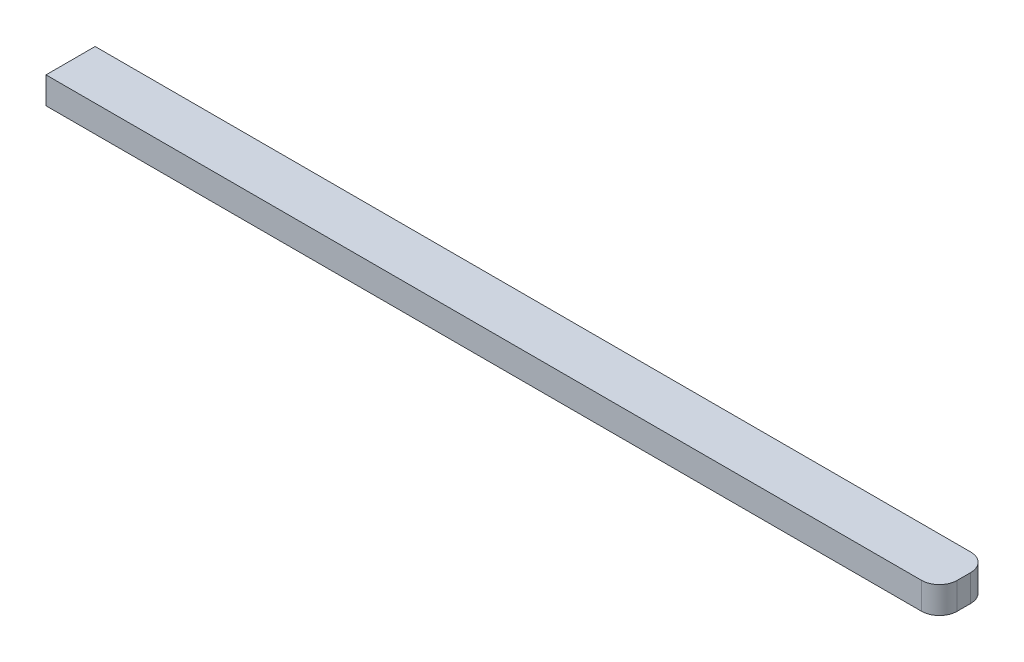
ISO-10303-21;
HEADER;
FILE_DESCRIPTION(('STEP AP214'),'2;1');
FILE_NAME('part.step','',(''),(''),'','','');
FILE_SCHEMA(('AUTOMOTIVE_DESIGN { 1 0 10303 214 1 1 1 1 }'));
ENDSEC;
DATA;
#1=APPLICATION_CONTEXT('core data for automotive mechanical design processes');
#2=APPLICATION_PROTOCOL_DEFINITION('international standard','automotive_design',2000,#1);
#3=PRODUCT_CONTEXT('',#1,'mechanical');
#4=PRODUCT('Part','Part','',(#3));
#5=PRODUCT_RELATED_PRODUCT_CATEGORY('part','',(#4));
#6=PRODUCT_DEFINITION_FORMATION('','',#4);
#7=PRODUCT_DEFINITION_CONTEXT('part definition',#1,'design');
#8=PRODUCT_DEFINITION('design','',#6,#7);
#9=PRODUCT_DEFINITION_SHAPE('','',#8);
#10=(LENGTH_UNIT() NAMED_UNIT(*) SI_UNIT(.MILLI.,.METRE.));
#11=(NAMED_UNIT(*) PLANE_ANGLE_UNIT() SI_UNIT($,.RADIAN.));
#12=(NAMED_UNIT(*) SI_UNIT($,.STERADIAN.) SOLID_ANGLE_UNIT());
#13=UNCERTAINTY_MEASURE_WITH_UNIT(LENGTH_MEASURE(1.E-05),#10,'distance_accuracy_value','');
#14=(GEOMETRIC_REPRESENTATION_CONTEXT(3) GLOBAL_UNCERTAINTY_ASSIGNED_CONTEXT((#13)) GLOBAL_UNIT_ASSIGNED_CONTEXT((#10,
#11,#12)) REPRESENTATION_CONTEXT('',''));
#15=CARTESIAN_POINT('',(0.,0.,0.));
#16=DIRECTION('',(0.,0.,1.));
#17=DIRECTION('',(1.,0.,0.));
#18=AXIS2_PLACEMENT_3D('',#15,#16,#17);
#19=CARTESIAN_POINT('',(-56.596735768236,3.,-1.88128287926879));
#20=DIRECTION('',(1.,0.,0.));
#21=DIRECTION('',(0.,0.,-1.));
#22=AXIS2_PLACEMENT_3D('',#19,#20,#21);
#23=PLANE('',#22);
#24=DIRECTION('',(0.,0.,1.));
#25=VECTOR('',#24,1.);
#26=CARTESIAN_POINT('',(-56.596735768236,0.,-1.88128287926879));
#27=LINE('',#26,#25);
#28=CARTESIAN_POINT('',(-56.596735768236,0.,-1.88128287926879));
#29=VERTEX_POINT('',#28);
#30=CARTESIAN_POINT('',(-56.596735768236,0.,3.61871712073121));
#31=VERTEX_POINT('',#30);
#32=EDGE_CURVE('E115',#29,#31,#27,.T.);
#33=ORIENTED_EDGE('',*,*,#32,.T.);
#34=DIRECTION('',(0.,-1.,0.));
#35=VECTOR('',#34,1.);
#36=CARTESIAN_POINT('',(-56.596735768236,3.,3.61871712073121));
#37=LINE('',#36,#35);
#38=CARTESIAN_POINT('',(-56.596735768236,3.,3.61871712073121));
#39=VERTEX_POINT('',#38);
#40=EDGE_CURVE('E96',#39,#31,#37,.T.);
#41=ORIENTED_EDGE('',*,*,#40,.F.);
#42=DIRECTION('',(0.,0.,1.));
#43=VECTOR('',#42,1.);
#44=CARTESIAN_POINT('',(-56.596735768236,3.,-1.88128287926879));
#45=LINE('',#44,#43);
#46=CARTESIAN_POINT('',(-56.596735768236,3.,-1.88128287926879));
#47=VERTEX_POINT('',#46);
#48=EDGE_CURVE('E102',#47,#39,#45,.T.);
#49=ORIENTED_EDGE('',*,*,#48,.F.);
#50=DIRECTION('',(0.,-1.,0.));
#51=VECTOR('',#50,1.);
#52=CARTESIAN_POINT('',(-56.596735768236,3.,-1.88128287926879));
#53=LINE('',#52,#51);
#54=EDGE_CURVE('E118',#47,#29,#53,.T.);
#55=ORIENTED_EDGE('',*,*,#54,.T.);
#56=EDGE_LOOP('',(#33,#41,#49,#55));
#57=FACE_BOUND('',#56,.T.);
#58=ADVANCED_FACE('F39',(#57),#23,.F.);
#59=CARTESIAN_POINT('',(-56.596735768236,3.,3.61871712073121));
#60=DIRECTION('',(0.,0.,-1.));
#61=DIRECTION('',(-1.,0.,0.));
#62=AXIS2_PLACEMENT_3D('',#59,#60,#61);
#63=PLANE('',#62);
#64=DIRECTION('',(1.,0.,0.));
#65=VECTOR('',#64,1.);
#66=CARTESIAN_POINT('',(-56.596735768236,0.,3.61871712073121));
#67=LINE('',#66,#65);
#68=CARTESIAN_POINT('',(41.403264231764,0.,3.61871712073121));
#69=VERTEX_POINT('',#68);
#70=EDGE_CURVE('E158',#31,#69,#67,.T.);
#71=ORIENTED_EDGE('',*,*,#70,.T.);
#72=DIRECTION('',(0.,-1.,0.));
#73=VECTOR('',#72,1.);
#74=CARTESIAN_POINT('',(41.403264231764,3.,3.61871712073121));
#75=LINE('',#74,#73);
#76=CARTESIAN_POINT('',(41.403264231764,3.,3.61871712073121));
#77=VERTEX_POINT('',#76);
#78=EDGE_CURVE('E11',#69,#77,#75,.F.);
#79=ORIENTED_EDGE('',*,*,#78,.T.);
#80=DIRECTION('',(1.,0.,0.));
#81=VECTOR('',#80,1.);
#82=CARTESIAN_POINT('',(-56.596735768236,3.,3.61871712073121));
#83=LINE('',#82,#81);
#84=EDGE_CURVE('E92',#39,#77,#83,.T.);
#85=ORIENTED_EDGE('',*,*,#84,.F.);
#86=ORIENTED_EDGE('',*,*,#40,.T.);
#87=EDGE_LOOP('',(#71,#79,#85,#86));
#88=FACE_BOUND('',#87,.T.);
#89=ADVANCED_FACE('F94',(#88),#63,.F.);
#90=CARTESIAN_POINT('',(43.403264231764,3.,-1.88128287926879));
#91=DIRECTION('',(-1.,0.,0.));
#92=DIRECTION('',(0.,0.,1.));
#93=AXIS2_PLACEMENT_3D('',#90,#91,#92);
#94=PLANE('',#93);
#95=DIRECTION('',(0.,0.,-1.));
#96=VECTOR('',#95,1.);
#97=CARTESIAN_POINT('',(43.403264231764,0.,-1.88128287926879));
#98=LINE('',#97,#96);
#99=CARTESIAN_POINT('',(43.403264231764,0.,1.61871712073121));
#100=VERTEX_POINT('',#99);
#101=CARTESIAN_POINT('',(43.403264231764,0.,0.118717120731211));
#102=VERTEX_POINT('',#101);
#103=EDGE_CURVE('E154',#100,#102,#98,.T.);
#104=ORIENTED_EDGE('',*,*,#103,.T.);
#105=DIRECTION('',(0.,-1.,0.));
#106=VECTOR('',#105,1.);
#107=CARTESIAN_POINT('',(43.403264231764,3.,0.118717120731211));
#108=LINE('',#107,#106);
#109=CARTESIAN_POINT('',(43.403264231764,3.,0.118717120731211));
#110=VERTEX_POINT('',#109);
#111=EDGE_CURVE('E61',#102,#110,#108,.F.);
#112=ORIENTED_EDGE('',*,*,#111,.T.);
#113=DIRECTION('',(0.,0.,-1.));
#114=VECTOR('',#113,1.);
#115=CARTESIAN_POINT('',(43.403264231764,3.,-1.88128287926879));
#116=LINE('',#115,#114);
#117=CARTESIAN_POINT('',(43.403264231764,3.,1.61871712073121));
#118=VERTEX_POINT('',#117);
#119=EDGE_CURVE('E101',#118,#110,#116,.T.);
#120=ORIENTED_EDGE('',*,*,#119,.F.);
#121=DIRECTION('',(0.,-1.,0.));
#122=VECTOR('',#121,1.);
#123=CARTESIAN_POINT('',(43.403264231764,3.,1.61871712073121));
#124=LINE('',#123,#122);
#125=EDGE_CURVE('E133',#118,#100,#124,.T.);
#126=ORIENTED_EDGE('',*,*,#125,.T.);
#127=EDGE_LOOP('',(#104,#112,#120,#126));
#128=FACE_BOUND('',#127,.T.);
#129=ADVANCED_FACE('F155',(#128),#94,.F.);
#130=CARTESIAN_POINT('',(-56.596735768236,3.,-1.88128287926879));
#131=DIRECTION('',(0.,0.,1.));
#132=DIRECTION('',(1.,0.,0.));
#133=AXIS2_PLACEMENT_3D('',#130,#131,#132);
#134=PLANE('',#133);
#135=DIRECTION('',(-1.,0.,0.));
#136=VECTOR('',#135,1.);
#137=CARTESIAN_POINT('',(-56.596735768236,3.,-1.88128287926879));
#138=LINE('',#137,#136);
#139=CARTESIAN_POINT('',(41.403264231764,3.,-1.88128287926879));
#140=VERTEX_POINT('',#139);
#141=EDGE_CURVE('E107',#140,#47,#138,.T.);
#142=ORIENTED_EDGE('',*,*,#141,.F.);
#143=DIRECTION('',(0.,-1.,0.));
#144=VECTOR('',#143,1.);
#145=CARTESIAN_POINT('',(41.403264231764,3.,-1.88128287926879));
#146=LINE('',#145,#144);
#147=CARTESIAN_POINT('',(41.403264231764,0.,-1.88128287926879));
#148=VERTEX_POINT('',#147);
#149=EDGE_CURVE('E117',#140,#148,#146,.T.);
#150=ORIENTED_EDGE('',*,*,#149,.T.);
#151=DIRECTION('',(-1.,0.,0.));
#152=VECTOR('',#151,1.);
#153=CARTESIAN_POINT('',(-56.596735768236,0.,-1.88128287926879));
#154=LINE('',#153,#152);
#155=EDGE_CURVE('E112',#148,#29,#154,.T.);
#156=ORIENTED_EDGE('',*,*,#155,.T.);
#157=ORIENTED_EDGE('',*,*,#54,.F.);
#158=EDGE_LOOP('',(#142,#150,#156,#157));
#159=FACE_BOUND('',#158,.T.);
#160=ADVANCED_FACE('F146',(#159),#134,.F.);
#161=CARTESIAN_POINT('',(0.,3.,0.));
#162=DIRECTION('',(0.,1.,0.));
#163=DIRECTION('',(0.,0.,1.));
#164=AXIS2_PLACEMENT_3D('',#161,#162,#163);
#165=PLANE('',#164);
#166=ORIENTED_EDGE('',*,*,#119,.T.);
#167=CARTESIAN_POINT('',(41.403264231764,3.,0.118717120731211));
#168=DIRECTION('',(0.,1.,0.));
#169=DIRECTION('',(0.,0.,1.));
#170=AXIS2_PLACEMENT_3D('',#167,#168,#169);
#171=CIRCLE('',#170,2.);
#172=EDGE_CURVE('E48',#110,#140,#171,.T.);
#173=ORIENTED_EDGE('',*,*,#172,.T.);
#174=ORIENTED_EDGE('',*,*,#141,.T.);
#175=ORIENTED_EDGE('',*,*,#48,.T.);
#176=ORIENTED_EDGE('',*,*,#84,.T.);
#177=CARTESIAN_POINT('',(41.403264231764,3.,1.61871712073121));
#178=DIRECTION('',(0.,1.,0.));
#179=DIRECTION('',(0.,0.,1.));
#180=AXIS2_PLACEMENT_3D('',#177,#178,#179);
#181=CIRCLE('',#180,2.);
#182=EDGE_CURVE('E139',#77,#118,#181,.T.);
#183=ORIENTED_EDGE('',*,*,#182,.T.);
#184=EDGE_LOOP('',(#166,#173,#174,#175,#176,#183));
#185=FACE_BOUND('',#184,.T.);
#186=ADVANCED_FACE('F105',(#185),#165,.T.);
#187=CARTESIAN_POINT('',(0.,0.,0.));
#188=DIRECTION('',(0.,1.,0.));
#189=DIRECTION('',(0.,0.,1.));
#190=AXIS2_PLACEMENT_3D('',#187,#188,#189);
#191=PLANE('',#190);
#192=ORIENTED_EDGE('',*,*,#155,.F.);
#193=CARTESIAN_POINT('',(41.403264231764,0.,0.118717120731211));
#194=DIRECTION('',(0.,1.,0.));
#195=DIRECTION('',(0.,0.,1.));
#196=AXIS2_PLACEMENT_3D('',#193,#194,#195);
#197=CIRCLE('',#196,2.);
#198=EDGE_CURVE('E130',#148,#102,#197,.F.);
#199=ORIENTED_EDGE('',*,*,#198,.T.);
#200=ORIENTED_EDGE('',*,*,#103,.F.);
#201=CARTESIAN_POINT('',(41.403264231764,0.,1.61871712073121));
#202=DIRECTION('',(0.,1.,0.));
#203=DIRECTION('',(0.,0.,1.));
#204=AXIS2_PLACEMENT_3D('',#201,#202,#203);
#205=CIRCLE('',#204,2.);
#206=EDGE_CURVE('E123',#100,#69,#205,.F.);
#207=ORIENTED_EDGE('',*,*,#206,.T.);
#208=ORIENTED_EDGE('',*,*,#70,.F.);
#209=ORIENTED_EDGE('',*,*,#32,.F.);
#210=EDGE_LOOP('',(#192,#199,#200,#207,#208,#209));
#211=FACE_BOUND('',#210,.T.);
#212=ADVANCED_FACE('F153',(#211),#191,.F.);
#213=CARTESIAN_POINT('',(41.403264231764,3.,0.118717120731211));
#214=DIRECTION('',(0.,-1.,0.));
#215=DIRECTION('',(0.,0.,-1.));
#216=AXIS2_PLACEMENT_3D('',#213,#214,#215);
#217=CYLINDRICAL_SURFACE('',#216,2.);
#218=ORIENTED_EDGE('',*,*,#172,.F.);
#219=ORIENTED_EDGE('',*,*,#111,.F.);
#220=ORIENTED_EDGE('',*,*,#198,.F.);
#221=ORIENTED_EDGE('',*,*,#149,.F.);
#222=EDGE_LOOP('',(#218,#219,#220,#221));
#223=FACE_BOUND('',#222,.T.);
#224=ADVANCED_FACE('F150',(#223),#217,.T.);
#225=CARTESIAN_POINT('',(41.403264231764,3.,1.61871712073121));
#226=DIRECTION('',(0.,-1.,0.));
#227=DIRECTION('',(0.,0.,-1.));
#228=AXIS2_PLACEMENT_3D('',#225,#226,#227);
#229=CYLINDRICAL_SURFACE('',#228,2.);
#230=ORIENTED_EDGE('',*,*,#182,.F.);
#231=ORIENTED_EDGE('',*,*,#78,.F.);
#232=ORIENTED_EDGE('',*,*,#206,.F.);
#233=ORIENTED_EDGE('',*,*,#125,.F.);
#234=EDGE_LOOP('',(#230,#231,#232,#233));
#235=FACE_BOUND('',#234,.T.);
#236=ADVANCED_FACE('F41',(#235),#229,.T.);
#237=CLOSED_SHELL('',(#58,#89,#129,#160,#186,#212,#224,#236));
#238=MANIFOLD_SOLID_BREP('B2',#237);
#239=ADVANCED_BREP_SHAPE_REPRESENTATION('',(#18,#238),#14);
#240=SHAPE_DEFINITION_REPRESENTATION(#9,#239);
ENDSEC;
END-ISO-10303-21;
